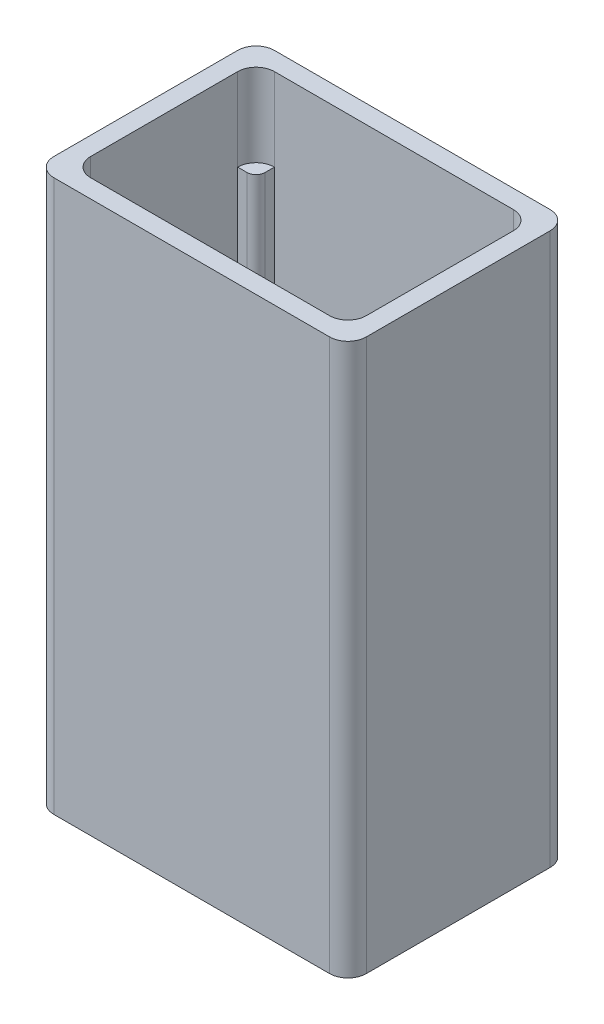
ISO-10303-21;
HEADER;
FILE_DESCRIPTION(('STEP AP214'),'2;1');
FILE_NAME('part.step','',(''),(''),'','','');
FILE_SCHEMA(('AUTOMOTIVE_DESIGN { 1 0 10303 214 1 1 1 1 }'));
ENDSEC;
DATA;
#1=APPLICATION_CONTEXT('core data for automotive mechanical design processes');
#2=APPLICATION_PROTOCOL_DEFINITION('international standard','automotive_design',2000,#1);
#3=PRODUCT_CONTEXT('',#1,'mechanical');
#4=PRODUCT('Part','Part','',(#3));
#5=PRODUCT_RELATED_PRODUCT_CATEGORY('part','',(#4));
#6=PRODUCT_DEFINITION_FORMATION('','',#4);
#7=PRODUCT_DEFINITION_CONTEXT('part definition',#1,'design');
#8=PRODUCT_DEFINITION('design','',#6,#7);
#9=PRODUCT_DEFINITION_SHAPE('','',#8);
#10=(LENGTH_UNIT() NAMED_UNIT(*) SI_UNIT(.MILLI.,.METRE.));
#11=(NAMED_UNIT(*) PLANE_ANGLE_UNIT() SI_UNIT($,.RADIAN.));
#12=(NAMED_UNIT(*) SI_UNIT($,.STERADIAN.) SOLID_ANGLE_UNIT());
#13=UNCERTAINTY_MEASURE_WITH_UNIT(LENGTH_MEASURE(1.E-05),#10,'distance_accuracy_value','');
#14=(GEOMETRIC_REPRESENTATION_CONTEXT(3) GLOBAL_UNCERTAINTY_ASSIGNED_CONTEXT((#13)) GLOBAL_UNIT_ASSIGNED_CONTEXT((#10,
#11,#12)) REPRESENTATION_CONTEXT('',''));
#15=CARTESIAN_POINT('',(0.,0.,0.));
#16=DIRECTION('',(0.,0.,1.));
#17=DIRECTION('',(1.,0.,0.));
#18=AXIS2_PLACEMENT_3D('',#15,#16,#17);
#19=CARTESIAN_POINT('',(15.,118.,8.));
#20=DIRECTION('',(-1.,0.,0.));
#21=DIRECTION('',(0.,0.,1.));
#22=AXIS2_PLACEMENT_3D('',#19,#20,#21);
#23=PLANE('',#22);
#24=DIRECTION('',(0.,0.,-1.));
#25=VECTOR('',#24,1.);
#26=CARTESIAN_POINT('',(15.,109.,-10.));
#27=LINE('',#26,#25);
#28=CARTESIAN_POINT('',(15.,109.,-6.93791118344072));
#29=VERTEX_POINT('',#28);
#30=CARTESIAN_POINT('',(15.,109.,-7.99999999999999));
#31=VERTEX_POINT('',#30);
#32=EDGE_CURVE('E223',#29,#31,#27,.T.);
#33=ORIENTED_EDGE('',*,*,#32,.F.);
#34=DIRECTION('',(0.,-1.,0.));
#35=VECTOR('',#34,1.);
#36=CARTESIAN_POINT('',(15.,109.,-6.93791118344072));
#37=LINE('',#36,#35);
#38=CARTESIAN_POINT('',(15.,58.,-6.93791118344072));
#39=VERTEX_POINT('',#38);
#40=EDGE_CURVE('E245',#29,#39,#37,.T.);
#41=ORIENTED_EDGE('',*,*,#40,.T.);
#42=DIRECTION('',(0.,0.,-1.));
#43=VECTOR('',#42,1.);
#44=CARTESIAN_POINT('',(15.,58.,8.));
#45=LINE('',#44,#43);
#46=CARTESIAN_POINT('',(15.,58.,8.));
#47=VERTEX_POINT('',#46);
#48=EDGE_CURVE('E269',#47,#39,#45,.T.);
#49=ORIENTED_EDGE('',*,*,#48,.F.);
#50=DIRECTION('',(0.,-1.,0.));
#51=VECTOR('',#50,1.);
#52=CARTESIAN_POINT('',(15.,118.,8.));
#53=LINE('',#52,#51);
#54=CARTESIAN_POINT('',(15.,118.,8.));
#55=VERTEX_POINT('',#54);
#56=EDGE_CURVE('E299',#55,#47,#53,.T.);
#57=ORIENTED_EDGE('',*,*,#56,.F.);
#58=DIRECTION('',(0.,0.,-1.));
#59=VECTOR('',#58,1.);
#60=CARTESIAN_POINT('',(15.,118.,8.));
#61=LINE('',#60,#59);
#62=CARTESIAN_POINT('',(15.,118.,-7.99999999999999));
#63=VERTEX_POINT('',#62);
#64=EDGE_CURVE('E250',#55,#63,#61,.T.);
#65=ORIENTED_EDGE('',*,*,#64,.T.);
#66=DIRECTION('',(0.,-1.,0.));
#67=VECTOR('',#66,1.);
#68=CARTESIAN_POINT('',(15.,118.,-7.99999999999999));
#69=LINE('',#68,#67);
#70=EDGE_CURVE('E296',#63,#31,#69,.T.);
#71=ORIENTED_EDGE('',*,*,#70,.T.);
#72=EDGE_LOOP('',(#33,#41,#49,#57,#65,#71));
#73=FACE_BOUND('',#72,.T.);
#74=ADVANCED_FACE('F33',(#73),#23,.T.);
#75=CARTESIAN_POINT('',(13.,118.,-8.00000000000001));
#76=DIRECTION('',(0.,-1.,0.));
#77=DIRECTION('',(0.,0.,-1.));
#78=AXIS2_PLACEMENT_3D('',#75,#76,#77);
#79=CYLINDRICAL_SURFACE('',#78,2.);
#80=DIRECTION('',(0.,-1.,0.));
#81=VECTOR('',#80,1.);
#82=CARTESIAN_POINT('',(13.,118.,-10.));
#83=LINE('',#82,#81);
#84=CARTESIAN_POINT('',(13.,118.,-10.));
#85=VERTEX_POINT('',#84);
#86=CARTESIAN_POINT('',(13.,109.,-10.));
#87=VERTEX_POINT('',#86);
#88=EDGE_CURVE('E293',#85,#87,#83,.T.);
#89=ORIENTED_EDGE('',*,*,#88,.T.);
#90=CARTESIAN_POINT('',(13.,109.,-8.00000000000001));
#91=DIRECTION('',(0.,-1.,0.));
#92=DIRECTION('',(0.,0.,-1.));
#93=AXIS2_PLACEMENT_3D('',#90,#91,#92);
#94=CIRCLE('',#93,2.);
#95=EDGE_CURVE('E41',#87,#31,#94,.T.);
#96=ORIENTED_EDGE('',*,*,#95,.T.);
#97=ORIENTED_EDGE('',*,*,#70,.F.);
#98=CARTESIAN_POINT('',(13.,118.,-8.00000000000001));
#99=DIRECTION('',(0.,1.,0.));
#100=DIRECTION('',(0.,0.,-1.));
#101=AXIS2_PLACEMENT_3D('',#98,#99,#100);
#102=CIRCLE('',#101,2.);
#103=EDGE_CURVE('E253',#63,#85,#102,.T.);
#104=ORIENTED_EDGE('',*,*,#103,.T.);
#105=EDGE_LOOP('',(#89,#96,#97,#104));
#106=FACE_BOUND('',#105,.T.);
#107=ADVANCED_FACE('F362',(#106),#79,.F.);
#108=CARTESIAN_POINT('',(15.,118.,10.));
#109=DIRECTION('',(0.,-1.,0.));
#110=DIRECTION('',(0.,0.,-1.));
#111=AXIS2_PLACEMENT_3D('',#108,#109,#110);
#112=PLANE('',#111);
#113=CARTESIAN_POINT('',(15.,118.,10.));
#114=DIRECTION('',(0.,1.,0.));
#115=DIRECTION('',(0.,0.,-1.));
#116=AXIS2_PLACEMENT_3D('',#113,#114,#115);
#117=CIRCLE('',#116,2.);
#118=CARTESIAN_POINT('',(15.,118.,12.));
#119=VERTEX_POINT('',#118);
#120=CARTESIAN_POINT('',(17.,118.,10.));
#121=VERTEX_POINT('',#120);
#122=EDGE_CURVE('E303',#119,#121,#117,.T.);
#123=ORIENTED_EDGE('',*,*,#122,.T.);
#124=DIRECTION('',(0.,0.,-1.));
#125=VECTOR('',#124,1.);
#126=CARTESIAN_POINT('',(17.,118.,10.));
#127=LINE('',#126,#125);
#128=CARTESIAN_POINT('',(17.,118.,-10.));
#129=VERTEX_POINT('',#128);
#130=EDGE_CURVE('E306',#121,#129,#127,.T.);
#131=ORIENTED_EDGE('',*,*,#130,.T.);
#132=CARTESIAN_POINT('',(15.,118.,-10.));
#133=DIRECTION('',(0.,1.,0.));
#134=DIRECTION('',(0.,0.,-1.));
#135=AXIS2_PLACEMENT_3D('',#132,#133,#134);
#136=CIRCLE('',#135,2.);
#137=CARTESIAN_POINT('',(15.,118.,-12.));
#138=VERTEX_POINT('',#137);
#139=EDGE_CURVE('E309',#129,#138,#136,.T.);
#140=ORIENTED_EDGE('',*,*,#139,.T.);
#141=DIRECTION('',(-1.,0.,0.));
#142=VECTOR('',#141,1.);
#143=CARTESIAN_POINT('',(-15.,118.,-12.));
#144=LINE('',#143,#142);
#145=CARTESIAN_POINT('',(-15.,118.,-12.));
#146=VERTEX_POINT('',#145);
#147=EDGE_CURVE('E311',#138,#146,#144,.T.);
#148=ORIENTED_EDGE('',*,*,#147,.T.);
#149=CARTESIAN_POINT('',(-15.,118.,-10.));
#150=DIRECTION('',(0.,1.,0.));
#151=DIRECTION('',(0.,0.,1.));
#152=AXIS2_PLACEMENT_3D('',#149,#150,#151);
#153=CIRCLE('',#152,2.);
#154=CARTESIAN_POINT('',(-17.,118.,-10.));
#155=VERTEX_POINT('',#154);
#156=EDGE_CURVE('E313',#146,#155,#153,.T.);
#157=ORIENTED_EDGE('',*,*,#156,.T.);
#158=DIRECTION('',(0.,0.,1.));
#159=VECTOR('',#158,1.);
#160=CARTESIAN_POINT('',(-17.,118.,10.));
#161=LINE('',#160,#159);
#162=CARTESIAN_POINT('',(-17.,118.,10.));
#163=VERTEX_POINT('',#162);
#164=EDGE_CURVE('E315',#155,#163,#161,.T.);
#165=ORIENTED_EDGE('',*,*,#164,.T.);
#166=CARTESIAN_POINT('',(-15.,118.,10.));
#167=DIRECTION('',(0.,1.,0.));
#168=DIRECTION('',(0.,0.,1.));
#169=AXIS2_PLACEMENT_3D('',#166,#167,#168);
#170=CIRCLE('',#169,2.);
#171=CARTESIAN_POINT('',(-15.,118.,12.));
#172=VERTEX_POINT('',#171);
#173=EDGE_CURVE('E317',#163,#172,#170,.T.);
#174=ORIENTED_EDGE('',*,*,#173,.T.);
#175=DIRECTION('',(1.,0.,0.));
#176=VECTOR('',#175,1.);
#177=CARTESIAN_POINT('',(-15.,118.,12.));
#178=LINE('',#177,#176);
#179=EDGE_CURVE('E319',#172,#119,#178,.T.);
#180=ORIENTED_EDGE('',*,*,#179,.T.);
#181=EDGE_LOOP('',(#123,#131,#140,#148,#157,#165,#174,#180));
#182=FACE_BOUND('',#181,.T.);
#183=CARTESIAN_POINT('',(13.,118.,8.));
#184=DIRECTION('',(0.,1.,0.));
#185=DIRECTION('',(0.,0.,-1.));
#186=AXIS2_PLACEMENT_3D('',#183,#184,#185);
#187=CIRCLE('',#186,2.);
#188=CARTESIAN_POINT('',(13.,118.,10.));
#189=VERTEX_POINT('',#188);
#190=EDGE_CURVE('E248',#189,#55,#187,.T.);
#191=ORIENTED_EDGE('',*,*,#190,.F.);
#192=DIRECTION('',(1.,0.,0.));
#193=VECTOR('',#192,1.);
#194=CARTESIAN_POINT('',(-13.,118.,10.));
#195=LINE('',#194,#193);
#196=CARTESIAN_POINT('',(-13.,118.,10.));
#197=VERTEX_POINT('',#196);
#198=EDGE_CURVE('E264',#197,#189,#195,.T.);
#199=ORIENTED_EDGE('',*,*,#198,.F.);
#200=CARTESIAN_POINT('',(-13.,118.,8.));
#201=DIRECTION('',(0.,1.,0.));
#202=DIRECTION('',(0.,0.,1.));
#203=AXIS2_PLACEMENT_3D('',#200,#201,#202);
#204=CIRCLE('',#203,2.);
#205=CARTESIAN_POINT('',(-15.,118.,8.));
#206=VERTEX_POINT('',#205);
#207=EDGE_CURVE('E261',#206,#197,#204,.T.);
#208=ORIENTED_EDGE('',*,*,#207,.F.);
#209=DIRECTION('',(0.,0.,1.));
#210=VECTOR('',#209,1.);
#211=CARTESIAN_POINT('',(-15.,118.,8.));
#212=LINE('',#211,#210);
#213=CARTESIAN_POINT('',(-15.,118.,-7.99999999999999));
#214=VERTEX_POINT('',#213);
#215=EDGE_CURVE('E259',#214,#206,#212,.T.);
#216=ORIENTED_EDGE('',*,*,#215,.F.);
#217=CARTESIAN_POINT('',(-13.,118.,-8.));
#218=DIRECTION('',(0.,1.,0.));
#219=DIRECTION('',(0.,0.,1.));
#220=AXIS2_PLACEMENT_3D('',#217,#218,#219);
#221=CIRCLE('',#220,2.);
#222=CARTESIAN_POINT('',(-13.,118.,-10.));
#223=VERTEX_POINT('',#222);
#224=EDGE_CURVE('E257',#223,#214,#221,.T.);
#225=ORIENTED_EDGE('',*,*,#224,.F.);
#226=DIRECTION('',(-1.,0.,0.));
#227=VECTOR('',#226,1.);
#228=CARTESIAN_POINT('',(-13.,118.,-10.));
#229=LINE('',#228,#227);
#230=EDGE_CURVE('E255',#85,#223,#229,.T.);
#231=ORIENTED_EDGE('',*,*,#230,.F.);
#232=ORIENTED_EDGE('',*,*,#103,.F.);
#233=ORIENTED_EDGE('',*,*,#64,.F.);
#234=EDGE_LOOP('',(#191,#199,#208,#216,#225,#231,#232,#233));
#235=FACE_BOUND('',#234,.T.);
#236=ADVANCED_FACE('F392',(#182,#235),#112,.F.);
#237=CARTESIAN_POINT('',(15.,58.,10.));
#238=DIRECTION('',(0.,-1.,0.));
#239=DIRECTION('',(0.,0.,-1.));
#240=AXIS2_PLACEMENT_3D('',#237,#238,#239);
#241=PLANE('',#240);
#242=DIRECTION('',(-1.,0.,0.));
#243=VECTOR('',#242,1.);
#244=CARTESIAN_POINT('',(-13.,58.,-10.));
#245=LINE('',#244,#243);
#246=CARTESIAN_POINT('',(13.,58.,-10.));
#247=VERTEX_POINT('',#246);
#248=CARTESIAN_POINT('',(-13.,58.,-10.));
#249=VERTEX_POINT('',#248);
#250=EDGE_CURVE('E272',#247,#249,#245,.T.);
#251=ORIENTED_EDGE('',*,*,#250,.T.);
#252=DIRECTION('',(0.,0.,-1.));
#253=VECTOR('',#252,1.);
#254=CARTESIAN_POINT('',(-13.,58.,-8.99999999999999));
#255=LINE('',#254,#253);
#256=CARTESIAN_POINT('',(-13.,58.,-8.99999999999999));
#257=VERTEX_POINT('',#256);
#258=EDGE_CURVE('E210',#257,#249,#255,.T.);
#259=ORIENTED_EDGE('',*,*,#258,.F.);
#260=CARTESIAN_POINT('',(-14.,58.,-8.99999999999999));
#261=DIRECTION('',(0.,1.,0.));
#262=DIRECTION('',(0.,0.,1.));
#263=AXIS2_PLACEMENT_3D('',#260,#261,#262);
#264=CIRCLE('',#263,1.);
#265=CARTESIAN_POINT('',(-14.,58.,-7.99999999999999));
#266=VERTEX_POINT('',#265);
#267=EDGE_CURVE('E214',#266,#257,#264,.T.);
#268=ORIENTED_EDGE('',*,*,#267,.F.);
#269=DIRECTION('',(1.,0.,0.));
#270=VECTOR('',#269,1.);
#271=CARTESIAN_POINT('',(-15.,58.,-7.99999999999999));
#272=LINE('',#271,#270);
#273=CARTESIAN_POINT('',(-15.,58.,-7.99999999999999));
#274=VERTEX_POINT('',#273);
#275=EDGE_CURVE('E198',#274,#266,#272,.T.);
#276=ORIENTED_EDGE('',*,*,#275,.F.);
#277=DIRECTION('',(0.,0.,1.));
#278=VECTOR('',#277,1.);
#279=CARTESIAN_POINT('',(-15.,58.,8.));
#280=LINE('',#279,#278);
#281=CARTESIAN_POINT('',(-15.,58.,8.));
#282=VERTEX_POINT('',#281);
#283=EDGE_CURVE('E275',#274,#282,#280,.T.);
#284=ORIENTED_EDGE('',*,*,#283,.T.);
#285=CARTESIAN_POINT('',(-13.,58.,8.));
#286=DIRECTION('',(0.,1.,0.));
#287=DIRECTION('',(0.,0.,1.));
#288=AXIS2_PLACEMENT_3D('',#285,#286,#287);
#289=CIRCLE('',#288,2.);
#290=CARTESIAN_POINT('',(-13.,58.,10.));
#291=VERTEX_POINT('',#290);
#292=EDGE_CURVE('E278',#282,#291,#289,.T.);
#293=ORIENTED_EDGE('',*,*,#292,.T.);
#294=DIRECTION('',(1.,0.,0.));
#295=VECTOR('',#294,1.);
#296=CARTESIAN_POINT('',(-13.,58.,10.));
#297=LINE('',#296,#295);
#298=CARTESIAN_POINT('',(13.,58.,10.));
#299=VERTEX_POINT('',#298);
#300=EDGE_CURVE('E251',#291,#299,#297,.T.);
#301=ORIENTED_EDGE('',*,*,#300,.T.);
#302=CARTESIAN_POINT('',(13.,58.,8.));
#303=DIRECTION('',(0.,1.,0.));
#304=DIRECTION('',(0.,0.,-1.));
#305=AXIS2_PLACEMENT_3D('',#302,#303,#304);
#306=CIRCLE('',#305,2.);
#307=EDGE_CURVE('E247',#299,#47,#306,.T.);
#308=ORIENTED_EDGE('',*,*,#307,.T.);
#309=ORIENTED_EDGE('',*,*,#48,.T.);
#310=DIRECTION('',(1.,0.,0.));
#311=VECTOR('',#310,1.);
#312=CARTESIAN_POINT('',(15.,58.,-6.93791118344072));
#313=LINE('',#312,#311);
#314=CARTESIAN_POINT('',(13.5,58.,-6.93791118344072));
#315=VERTEX_POINT('',#314);
#316=EDGE_CURVE('E219',#315,#39,#313,.T.);
#317=ORIENTED_EDGE('',*,*,#316,.F.);
#318=CARTESIAN_POINT('',(13.5,58.,-7.43791118344072));
#319=DIRECTION('',(0.,1.,0.));
#320=DIRECTION('',(0.,0.,-1.));
#321=AXIS2_PLACEMENT_3D('',#318,#319,#320);
#322=CIRCLE('',#321,0.5);
#323=CARTESIAN_POINT('',(13.,58.,-7.43791118344072));
#324=VERTEX_POINT('',#323);
#325=EDGE_CURVE('E224',#324,#315,#322,.T.);
#326=ORIENTED_EDGE('',*,*,#325,.F.);
#327=DIRECTION('',(0.,0.,1.));
#328=VECTOR('',#327,1.);
#329=CARTESIAN_POINT('',(13.,58.,-7.43791118344072));
#330=LINE('',#329,#328);
#331=EDGE_CURVE('E234',#247,#324,#330,.T.);
#332=ORIENTED_EDGE('',*,*,#331,.F.);
#333=EDGE_LOOP('',(#251,#259,#268,#276,#284,#293,#301,#308,#309,#317,#326,#332));
#334=FACE_BOUND('',#333,.T.);
#335=CARTESIAN_POINT('',(15.,58.,10.));
#336=DIRECTION('',(0.,1.,0.));
#337=DIRECTION('',(0.,0.,-1.));
#338=AXIS2_PLACEMENT_3D('',#335,#336,#337);
#339=CIRCLE('',#338,2.);
#340=CARTESIAN_POINT('',(15.,58.,12.));
#341=VERTEX_POINT('',#340);
#342=CARTESIAN_POINT('',(17.,58.,10.));
#343=VERTEX_POINT('',#342);
#344=EDGE_CURVE('E302',#341,#343,#339,.T.);
#345=ORIENTED_EDGE('',*,*,#344,.F.);
#346=DIRECTION('',(1.,0.,0.));
#347=VECTOR('',#346,1.);
#348=CARTESIAN_POINT('',(-15.,58.,12.));
#349=LINE('',#348,#347);
#350=CARTESIAN_POINT('',(-15.,58.,12.));
#351=VERTEX_POINT('',#350);
#352=EDGE_CURVE('E307',#351,#341,#349,.T.);
#353=ORIENTED_EDGE('',*,*,#352,.F.);
#354=CARTESIAN_POINT('',(-15.,58.,10.));
#355=DIRECTION('',(0.,1.,0.));
#356=DIRECTION('',(0.,0.,1.));
#357=AXIS2_PLACEMENT_3D('',#354,#355,#356);
#358=CIRCLE('',#357,2.);
#359=CARTESIAN_POINT('',(-17.,58.,10.));
#360=VERTEX_POINT('',#359);
#361=EDGE_CURVE('E334',#360,#351,#358,.T.);
#362=ORIENTED_EDGE('',*,*,#361,.F.);
#363=DIRECTION('',(0.,0.,1.));
#364=VECTOR('',#363,1.);
#365=CARTESIAN_POINT('',(-17.,58.,10.));
#366=LINE('',#365,#364);
#367=CARTESIAN_POINT('',(-17.,58.,-10.));
#368=VERTEX_POINT('',#367);
#369=EDGE_CURVE('E332',#368,#360,#366,.T.);
#370=ORIENTED_EDGE('',*,*,#369,.F.);
#371=CARTESIAN_POINT('',(-15.,58.,-10.));
#372=DIRECTION('',(0.,1.,0.));
#373=DIRECTION('',(0.,0.,1.));
#374=AXIS2_PLACEMENT_3D('',#371,#372,#373);
#375=CIRCLE('',#374,2.);
#376=CARTESIAN_POINT('',(-15.,58.,-12.));
#377=VERTEX_POINT('',#376);
#378=EDGE_CURVE('E330',#377,#368,#375,.T.);
#379=ORIENTED_EDGE('',*,*,#378,.F.);
#380=DIRECTION('',(-1.,0.,0.));
#381=VECTOR('',#380,1.);
#382=CARTESIAN_POINT('',(-15.,58.,-12.));
#383=LINE('',#382,#381);
#384=CARTESIAN_POINT('',(15.,58.,-12.));
#385=VERTEX_POINT('',#384);
#386=EDGE_CURVE('E328',#385,#377,#383,.T.);
#387=ORIENTED_EDGE('',*,*,#386,.F.);
#388=CARTESIAN_POINT('',(15.,58.,-10.));
#389=DIRECTION('',(0.,1.,0.));
#390=DIRECTION('',(0.,0.,-1.));
#391=AXIS2_PLACEMENT_3D('',#388,#389,#390);
#392=CIRCLE('',#391,2.);
#393=CARTESIAN_POINT('',(17.,58.,-10.));
#394=VERTEX_POINT('',#393);
#395=EDGE_CURVE('E326',#394,#385,#392,.T.);
#396=ORIENTED_EDGE('',*,*,#395,.F.);
#397=DIRECTION('',(0.,0.,-1.));
#398=VECTOR('',#397,1.);
#399=CARTESIAN_POINT('',(17.,58.,10.));
#400=LINE('',#399,#398);
#401=EDGE_CURVE('E324',#343,#394,#400,.T.);
#402=ORIENTED_EDGE('',*,*,#401,.F.);
#403=EDGE_LOOP('',(#345,#353,#362,#370,#379,#387,#396,#402));
#404=FACE_BOUND('',#403,.T.);
#405=ADVANCED_FACE('F379',(#334,#404),#241,.T.);
#406=CARTESIAN_POINT('',(15.,118.,10.));
#407=DIRECTION('',(0.,-1.,0.));
#408=DIRECTION('',(0.,0.,-1.));
#409=AXIS2_PLACEMENT_3D('',#406,#407,#408);
#410=CYLINDRICAL_SURFACE('',#409,2.);
#411=ORIENTED_EDGE('',*,*,#344,.T.);
#412=DIRECTION('',(0.,-1.,0.));
#413=VECTOR('',#412,1.);
#414=CARTESIAN_POINT('',(17.,118.,10.));
#415=LINE('',#414,#413);
#416=EDGE_CURVE('E357',#121,#343,#415,.T.);
#417=ORIENTED_EDGE('',*,*,#416,.F.);
#418=ORIENTED_EDGE('',*,*,#122,.F.);
#419=DIRECTION('',(0.,-1.,0.));
#420=VECTOR('',#419,1.);
#421=CARTESIAN_POINT('',(15.,118.,12.));
#422=LINE('',#421,#420);
#423=EDGE_CURVE('E321',#119,#341,#422,.T.);
#424=ORIENTED_EDGE('',*,*,#423,.T.);
#425=EDGE_LOOP('',(#411,#417,#418,#424));
#426=FACE_BOUND('',#425,.T.);
#427=ADVANCED_FACE('F35',(#426),#410,.T.);
#428=CARTESIAN_POINT('',(17.,118.,10.));
#429=DIRECTION('',(-1.,0.,0.));
#430=DIRECTION('',(0.,0.,1.));
#431=AXIS2_PLACEMENT_3D('',#428,#429,#430);
#432=PLANE('',#431);
#433=ORIENTED_EDGE('',*,*,#401,.T.);
#434=DIRECTION('',(0.,-1.,0.));
#435=VECTOR('',#434,1.);
#436=CARTESIAN_POINT('',(17.,118.,-10.));
#437=LINE('',#436,#435);
#438=EDGE_CURVE('E354',#129,#394,#437,.T.);
#439=ORIENTED_EDGE('',*,*,#438,.F.);
#440=ORIENTED_EDGE('',*,*,#130,.F.);
#441=ORIENTED_EDGE('',*,*,#416,.T.);
#442=EDGE_LOOP('',(#433,#439,#440,#441));
#443=FACE_BOUND('',#442,.T.);
#444=ADVANCED_FACE('F452',(#443),#432,.F.);
#445=CARTESIAN_POINT('',(15.,118.,-10.));
#446=DIRECTION('',(0.,-1.,0.));
#447=DIRECTION('',(0.,0.,-1.));
#448=AXIS2_PLACEMENT_3D('',#445,#446,#447);
#449=CYLINDRICAL_SURFACE('',#448,2.);
#450=ORIENTED_EDGE('',*,*,#395,.T.);
#451=DIRECTION('',(0.,-1.,0.));
#452=VECTOR('',#451,1.);
#453=CARTESIAN_POINT('',(15.,118.,-12.));
#454=LINE('',#453,#452);
#455=EDGE_CURVE('E351',#138,#385,#454,.T.);
#456=ORIENTED_EDGE('',*,*,#455,.F.);
#457=ORIENTED_EDGE('',*,*,#139,.F.);
#458=ORIENTED_EDGE('',*,*,#438,.T.);
#459=EDGE_LOOP('',(#450,#456,#457,#458));
#460=FACE_BOUND('',#459,.T.);
#461=ADVANCED_FACE('F449',(#460),#449,.T.);
#462=CARTESIAN_POINT('',(-15.,118.,-12.));
#463=DIRECTION('',(0.,0.,1.));
#464=DIRECTION('',(1.,0.,0.));
#465=AXIS2_PLACEMENT_3D('',#462,#463,#464);
#466=PLANE('',#465);
#467=ORIENTED_EDGE('',*,*,#386,.T.);
#468=DIRECTION('',(0.,-1.,0.));
#469=VECTOR('',#468,1.);
#470=CARTESIAN_POINT('',(-15.,118.,-12.));
#471=LINE('',#470,#469);
#472=EDGE_CURVE('E348',#146,#377,#471,.T.);
#473=ORIENTED_EDGE('',*,*,#472,.F.);
#474=ORIENTED_EDGE('',*,*,#147,.F.);
#475=ORIENTED_EDGE('',*,*,#455,.T.);
#476=EDGE_LOOP('',(#467,#473,#474,#475));
#477=FACE_BOUND('',#476,.T.);
#478=ADVANCED_FACE('F445',(#477),#466,.F.);
#479=CARTESIAN_POINT('',(-15.,118.,-10.));
#480=DIRECTION('',(0.,-1.,0.));
#481=DIRECTION('',(0.,0.,-1.));
#482=AXIS2_PLACEMENT_3D('',#479,#480,#481);
#483=CYLINDRICAL_SURFACE('',#482,2.);
#484=ORIENTED_EDGE('',*,*,#378,.T.);
#485=DIRECTION('',(0.,-1.,0.));
#486=VECTOR('',#485,1.);
#487=CARTESIAN_POINT('',(-17.,118.,-10.));
#488=LINE('',#487,#486);
#489=EDGE_CURVE('E345',#155,#368,#488,.T.);
#490=ORIENTED_EDGE('',*,*,#489,.F.);
#491=ORIENTED_EDGE('',*,*,#156,.F.);
#492=ORIENTED_EDGE('',*,*,#472,.T.);
#493=EDGE_LOOP('',(#484,#490,#491,#492));
#494=FACE_BOUND('',#493,.T.);
#495=ADVANCED_FACE('F441',(#494),#483,.T.);
#496=CARTESIAN_POINT('',(-17.,118.,10.));
#497=DIRECTION('',(1.,0.,0.));
#498=DIRECTION('',(0.,0.,-1.));
#499=AXIS2_PLACEMENT_3D('',#496,#497,#498);
#500=PLANE('',#499);
#501=ORIENTED_EDGE('',*,*,#369,.T.);
#502=DIRECTION('',(0.,-1.,0.));
#503=VECTOR('',#502,1.);
#504=CARTESIAN_POINT('',(-17.,118.,10.));
#505=LINE('',#504,#503);
#506=EDGE_CURVE('E342',#163,#360,#505,.T.);
#507=ORIENTED_EDGE('',*,*,#506,.F.);
#508=ORIENTED_EDGE('',*,*,#164,.F.);
#509=ORIENTED_EDGE('',*,*,#489,.T.);
#510=EDGE_LOOP('',(#501,#507,#508,#509));
#511=FACE_BOUND('',#510,.T.);
#512=ADVANCED_FACE('F437',(#511),#500,.F.);
#513=CARTESIAN_POINT('',(-15.,118.,10.));
#514=DIRECTION('',(0.,-1.,0.));
#515=DIRECTION('',(0.,0.,-1.));
#516=AXIS2_PLACEMENT_3D('',#513,#514,#515);
#517=CYLINDRICAL_SURFACE('',#516,2.);
#518=ORIENTED_EDGE('',*,*,#361,.T.);
#519=DIRECTION('',(0.,-1.,0.));
#520=VECTOR('',#519,1.);
#521=CARTESIAN_POINT('',(-15.,118.,12.));
#522=LINE('',#521,#520);
#523=EDGE_CURVE('E339',#172,#351,#522,.T.);
#524=ORIENTED_EDGE('',*,*,#523,.F.);
#525=ORIENTED_EDGE('',*,*,#173,.F.);
#526=ORIENTED_EDGE('',*,*,#506,.T.);
#527=EDGE_LOOP('',(#518,#524,#525,#526));
#528=FACE_BOUND('',#527,.T.);
#529=ADVANCED_FACE('F433',(#528),#517,.T.);
#530=CARTESIAN_POINT('',(-15.,118.,12.));
#531=DIRECTION('',(0.,0.,-1.));
#532=DIRECTION('',(-1.,0.,0.));
#533=AXIS2_PLACEMENT_3D('',#530,#531,#532);
#534=PLANE('',#533);
#535=ORIENTED_EDGE('',*,*,#352,.T.);
#536=ORIENTED_EDGE('',*,*,#423,.F.);
#537=ORIENTED_EDGE('',*,*,#179,.F.);
#538=ORIENTED_EDGE('',*,*,#523,.T.);
#539=EDGE_LOOP('',(#535,#536,#537,#538));
#540=FACE_BOUND('',#539,.T.);
#541=ADVANCED_FACE('F425',(#540),#534,.F.);
#542=CARTESIAN_POINT('',(13.,118.,8.));
#543=DIRECTION('',(0.,-1.,0.));
#544=DIRECTION('',(0.,0.,-1.));
#545=AXIS2_PLACEMENT_3D('',#542,#543,#544);
#546=CYLINDRICAL_SURFACE('',#545,2.);
#547=ORIENTED_EDGE('',*,*,#307,.F.);
#548=DIRECTION('',(0.,-1.,0.));
#549=VECTOR('',#548,1.);
#550=CARTESIAN_POINT('',(13.,118.,10.));
#551=LINE('',#550,#549);
#552=EDGE_CURVE('E266',#189,#299,#551,.T.);
#553=ORIENTED_EDGE('',*,*,#552,.F.);
#554=ORIENTED_EDGE('',*,*,#190,.T.);
#555=ORIENTED_EDGE('',*,*,#56,.T.);
#556=EDGE_LOOP('',(#547,#553,#554,#555));
#557=FACE_BOUND('',#556,.T.);
#558=ADVANCED_FACE('F385',(#557),#546,.F.);
#559=CARTESIAN_POINT('',(-13.,118.,-10.));
#560=DIRECTION('',(0.,0.,1.));
#561=DIRECTION('',(1.,0.,0.));
#562=AXIS2_PLACEMENT_3D('',#559,#560,#561);
#563=PLANE('',#562);
#564=ORIENTED_EDGE('',*,*,#250,.F.);
#565=DIRECTION('',(0.,-1.,0.));
#566=VECTOR('',#565,1.);
#567=CARTESIAN_POINT('',(13.,109.,-10.));
#568=LINE('',#567,#566);
#569=EDGE_CURVE('E242',#87,#247,#568,.T.);
#570=ORIENTED_EDGE('',*,*,#569,.F.);
#571=ORIENTED_EDGE('',*,*,#88,.F.);
#572=ORIENTED_EDGE('',*,*,#230,.T.);
#573=DIRECTION('',(0.,-1.,0.));
#574=VECTOR('',#573,1.);
#575=CARTESIAN_POINT('',(-13.,118.,-10.));
#576=LINE('',#575,#574);
#577=CARTESIAN_POINT('',(-13.,109.,-10.));
#578=VERTEX_POINT('',#577);
#579=EDGE_CURVE('E291',#223,#578,#576,.T.);
#580=ORIENTED_EDGE('',*,*,#579,.T.);
#581=DIRECTION('',(0.,-1.,0.));
#582=VECTOR('',#581,1.);
#583=CARTESIAN_POINT('',(-13.,109.,-10.));
#584=LINE('',#583,#582);
#585=EDGE_CURVE('E217',#578,#249,#584,.T.);
#586=ORIENTED_EDGE('',*,*,#585,.T.);
#587=EDGE_LOOP('',(#564,#570,#571,#572,#580,#586));
#588=FACE_BOUND('',#587,.T.);
#589=ADVANCED_FACE('F397',(#588),#563,.T.);
#590=CARTESIAN_POINT('',(-13.,118.,-8.));
#591=DIRECTION('',(0.,-1.,0.));
#592=DIRECTION('',(0.,0.,-1.));
#593=AXIS2_PLACEMENT_3D('',#590,#591,#592);
#594=CYLINDRICAL_SURFACE('',#593,2.);
#595=CARTESIAN_POINT('',(-13.,109.,-8.));
#596=DIRECTION('',(0.,1.,0.));
#597=DIRECTION('',(0.,0.,1.));
#598=AXIS2_PLACEMENT_3D('',#595,#596,#597);
#599=CIRCLE('',#598,2.);
#600=CARTESIAN_POINT('',(-15.,109.,-7.99999999999999));
#601=VERTEX_POINT('',#600);
#602=EDGE_CURVE('E11',#578,#601,#599,.T.);
#603=ORIENTED_EDGE('',*,*,#602,.F.);
#604=ORIENTED_EDGE('',*,*,#579,.F.);
#605=ORIENTED_EDGE('',*,*,#224,.T.);
#606=DIRECTION('',(0.,-1.,0.));
#607=VECTOR('',#606,1.);
#608=CARTESIAN_POINT('',(-15.,118.,-7.99999999999999));
#609=LINE('',#608,#607);
#610=EDGE_CURVE('E289',#214,#601,#609,.T.);
#611=ORIENTED_EDGE('',*,*,#610,.T.);
#612=EDGE_LOOP('',(#603,#604,#605,#611));
#613=FACE_BOUND('',#612,.T.);
#614=ADVANCED_FACE('F643',(#613),#594,.F.);
#615=CARTESIAN_POINT('',(-15.,118.,8.));
#616=DIRECTION('',(1.,0.,0.));
#617=DIRECTION('',(0.,0.,-1.));
#618=AXIS2_PLACEMENT_3D('',#615,#616,#617);
#619=PLANE('',#618);
#620=ORIENTED_EDGE('',*,*,#283,.F.);
#621=DIRECTION('',(0.,-1.,0.));
#622=VECTOR('',#621,1.);
#623=CARTESIAN_POINT('',(-15.,109.,-7.99999999999999));
#624=LINE('',#623,#622);
#625=EDGE_CURVE('E54',#601,#274,#624,.T.);
#626=ORIENTED_EDGE('',*,*,#625,.F.);
#627=ORIENTED_EDGE('',*,*,#610,.F.);
#628=ORIENTED_EDGE('',*,*,#215,.T.);
#629=DIRECTION('',(0.,-1.,0.));
#630=VECTOR('',#629,1.);
#631=CARTESIAN_POINT('',(-15.,118.,8.));
#632=LINE('',#631,#630);
#633=EDGE_CURVE('E287',#206,#282,#632,.T.);
#634=ORIENTED_EDGE('',*,*,#633,.T.);
#635=EDGE_LOOP('',(#620,#626,#627,#628,#634));
#636=FACE_BOUND('',#635,.T.);
#637=ADVANCED_FACE('F521',(#636),#619,.T.);
#638=CARTESIAN_POINT('',(-13.,118.,8.));
#639=DIRECTION('',(0.,-1.,0.));
#640=DIRECTION('',(0.,0.,-1.));
#641=AXIS2_PLACEMENT_3D('',#638,#639,#640);
#642=CYLINDRICAL_SURFACE('',#641,2.);
#643=ORIENTED_EDGE('',*,*,#292,.F.);
#644=ORIENTED_EDGE('',*,*,#633,.F.);
#645=ORIENTED_EDGE('',*,*,#207,.T.);
#646=DIRECTION('',(0.,-1.,0.));
#647=VECTOR('',#646,1.);
#648=CARTESIAN_POINT('',(-13.,118.,10.));
#649=LINE('',#648,#647);
#650=EDGE_CURVE('E285',#197,#291,#649,.T.);
#651=ORIENTED_EDGE('',*,*,#650,.T.);
#652=EDGE_LOOP('',(#643,#644,#645,#651));
#653=FACE_BOUND('',#652,.T.);
#654=ADVANCED_FACE('F511',(#653),#642,.F.);
#655=CARTESIAN_POINT('',(-13.,118.,10.));
#656=DIRECTION('',(0.,0.,-1.));
#657=DIRECTION('',(-1.,0.,0.));
#658=AXIS2_PLACEMENT_3D('',#655,#656,#657);
#659=PLANE('',#658);
#660=ORIENTED_EDGE('',*,*,#300,.F.);
#661=ORIENTED_EDGE('',*,*,#650,.F.);
#662=ORIENTED_EDGE('',*,*,#198,.T.);
#663=ORIENTED_EDGE('',*,*,#552,.T.);
#664=EDGE_LOOP('',(#660,#661,#662,#663));
#665=FACE_BOUND('',#664,.T.);
#666=ADVANCED_FACE('F388',(#665),#659,.T.);
#667=CARTESIAN_POINT('',(13.5,109.,-7.43791118344072));
#668=DIRECTION('',(0.,-1.,0.));
#669=DIRECTION('',(0.,0.,-1.));
#670=AXIS2_PLACEMENT_3D('',#667,#668,#669);
#671=PLANE('',#670);
#672=ORIENTED_EDGE('',*,*,#95,.F.);
#673=DIRECTION('',(0.,0.,1.));
#674=VECTOR('',#673,1.);
#675=CARTESIAN_POINT('',(13.,109.,-7.43791118344072));
#676=LINE('',#675,#674);
#677=CARTESIAN_POINT('',(13.,109.,-7.43791118344072));
#678=VERTEX_POINT('',#677);
#679=EDGE_CURVE('E227',#87,#678,#676,.T.);
#680=ORIENTED_EDGE('',*,*,#679,.T.);
#681=CARTESIAN_POINT('',(13.5,109.,-7.43791118344072));
#682=DIRECTION('',(0.,1.,0.));
#683=DIRECTION('',(0.,0.,-1.));
#684=AXIS2_PLACEMENT_3D('',#681,#682,#683);
#685=CIRCLE('',#684,0.5);
#686=CARTESIAN_POINT('',(13.5,109.,-6.93791118344072));
#687=VERTEX_POINT('',#686);
#688=EDGE_CURVE('E229',#678,#687,#685,.T.);
#689=ORIENTED_EDGE('',*,*,#688,.T.);
#690=DIRECTION('',(1.,0.,0.));
#691=VECTOR('',#690,1.);
#692=CARTESIAN_POINT('',(15.,109.,-6.93791118344072));
#693=LINE('',#692,#691);
#694=EDGE_CURVE('E220',#687,#29,#693,.T.);
#695=ORIENTED_EDGE('',*,*,#694,.T.);
#696=ORIENTED_EDGE('',*,*,#32,.T.);
#697=EDGE_LOOP('',(#672,#680,#689,#695,#696));
#698=FACE_BOUND('',#697,.T.);
#699=ADVANCED_FACE('F370',(#698),#671,.F.);
#700=CARTESIAN_POINT('',(15.,109.,-6.93791118344072));
#701=DIRECTION('',(0.,0.,-1.));
#702=DIRECTION('',(-1.,0.,0.));
#703=AXIS2_PLACEMENT_3D('',#700,#701,#702);
#704=PLANE('',#703);
#705=ORIENTED_EDGE('',*,*,#316,.T.);
#706=ORIENTED_EDGE('',*,*,#40,.F.);
#707=ORIENTED_EDGE('',*,*,#694,.F.);
#708=DIRECTION('',(0.,-1.,0.));
#709=VECTOR('',#708,1.);
#710=CARTESIAN_POINT('',(13.5,109.,-6.93791118344072));
#711=LINE('',#710,#709);
#712=EDGE_CURVE('E231',#687,#315,#711,.T.);
#713=ORIENTED_EDGE('',*,*,#712,.T.);
#714=EDGE_LOOP('',(#705,#706,#707,#713));
#715=FACE_BOUND('',#714,.T.);
#716=ADVANCED_FACE('F376',(#715),#704,.F.);
#717=CARTESIAN_POINT('',(13.,109.,-7.43791118344072));
#718=DIRECTION('',(1.,0.,0.));
#719=DIRECTION('',(0.,0.,-1.));
#720=AXIS2_PLACEMENT_3D('',#717,#718,#719);
#721=PLANE('',#720);
#722=ORIENTED_EDGE('',*,*,#331,.T.);
#723=DIRECTION('',(0.,-1.,0.));
#724=VECTOR('',#723,1.);
#725=CARTESIAN_POINT('',(13.,109.,-7.43791118344072));
#726=LINE('',#725,#724);
#727=EDGE_CURVE('E239',#678,#324,#726,.T.);
#728=ORIENTED_EDGE('',*,*,#727,.F.);
#729=ORIENTED_EDGE('',*,*,#679,.F.);
#730=ORIENTED_EDGE('',*,*,#569,.T.);
#731=EDGE_LOOP('',(#722,#728,#729,#730));
#732=FACE_BOUND('',#731,.T.);
#733=ADVANCED_FACE('F400',(#732),#721,.F.);
#734=CARTESIAN_POINT('',(13.5,109.,-7.43791118344072));
#735=DIRECTION('',(0.,-1.,0.));
#736=DIRECTION('',(0.,0.,-1.));
#737=AXIS2_PLACEMENT_3D('',#734,#735,#736);
#738=CYLINDRICAL_SURFACE('',#737,0.5);
#739=ORIENTED_EDGE('',*,*,#325,.T.);
#740=ORIENTED_EDGE('',*,*,#712,.F.);
#741=ORIENTED_EDGE('',*,*,#688,.F.);
#742=ORIENTED_EDGE('',*,*,#727,.T.);
#743=EDGE_LOOP('',(#739,#740,#741,#742));
#744=FACE_BOUND('',#743,.T.);
#745=ADVANCED_FACE('F404',(#744),#738,.T.);
#746=CARTESIAN_POINT('',(-14.,109.,-8.99999999999999));
#747=DIRECTION('',(0.,1.,0.));
#748=DIRECTION('',(0.,0.,1.));
#749=AXIS2_PLACEMENT_3D('',#746,#747,#748);
#750=PLANE('',#749);
#751=DIRECTION('',(0.,0.,-1.));
#752=VECTOR('',#751,1.);
#753=CARTESIAN_POINT('',(-13.,109.,-8.99999999999999));
#754=LINE('',#753,#752);
#755=CARTESIAN_POINT('',(-13.,109.,-8.99999999999999));
#756=VERTEX_POINT('',#755);
#757=EDGE_CURVE('E192',#756,#578,#754,.T.);
#758=ORIENTED_EDGE('',*,*,#757,.T.);
#759=ORIENTED_EDGE('',*,*,#602,.T.);
#760=DIRECTION('',(1.,0.,0.));
#761=VECTOR('',#760,1.);
#762=CARTESIAN_POINT('',(-15.,109.,-7.99999999999999));
#763=LINE('',#762,#761);
#764=CARTESIAN_POINT('',(-14.,109.,-7.99999999999999));
#765=VERTEX_POINT('',#764);
#766=EDGE_CURVE('E184',#601,#765,#763,.T.);
#767=ORIENTED_EDGE('',*,*,#766,.T.);
#768=CARTESIAN_POINT('',(-14.,109.,-8.99999999999999));
#769=DIRECTION('',(0.,1.,0.));
#770=DIRECTION('',(0.,0.,1.));
#771=AXIS2_PLACEMENT_3D('',#768,#769,#770);
#772=CIRCLE('',#771,1.);
#773=EDGE_CURVE('E189',#765,#756,#772,.T.);
#774=ORIENTED_EDGE('',*,*,#773,.T.);
#775=EDGE_LOOP('',(#758,#759,#767,#774));
#776=FACE_BOUND('',#775,.T.);
#777=ADVANCED_FACE('F187',(#776),#750,.T.);
#778=CARTESIAN_POINT('',(-13.,109.,-8.99999999999999));
#779=DIRECTION('',(-1.,0.,0.));
#780=DIRECTION('',(0.,0.,1.));
#781=AXIS2_PLACEMENT_3D('',#778,#779,#780);
#782=PLANE('',#781);
#783=ORIENTED_EDGE('',*,*,#258,.T.);
#784=ORIENTED_EDGE('',*,*,#585,.F.);
#785=ORIENTED_EDGE('',*,*,#757,.F.);
#786=DIRECTION('',(0.,-1.,0.));
#787=VECTOR('',#786,1.);
#788=CARTESIAN_POINT('',(-13.,109.,-8.99999999999999));
#789=LINE('',#788,#787);
#790=EDGE_CURVE('E201',#756,#257,#789,.T.);
#791=ORIENTED_EDGE('',*,*,#790,.T.);
#792=EDGE_LOOP('',(#783,#784,#785,#791));
#793=FACE_BOUND('',#792,.T.);
#794=ADVANCED_FACE('F411',(#793),#782,.F.);
#795=CARTESIAN_POINT('',(-15.,109.,-7.99999999999999));
#796=DIRECTION('',(0.,0.,-1.));
#797=DIRECTION('',(-1.,0.,0.));
#798=AXIS2_PLACEMENT_3D('',#795,#796,#797);
#799=PLANE('',#798);
#800=ORIENTED_EDGE('',*,*,#275,.T.);
#801=DIRECTION('',(0.,-1.,0.));
#802=VECTOR('',#801,1.);
#803=CARTESIAN_POINT('',(-14.,109.,-7.99999999999999));
#804=LINE('',#803,#802);
#805=EDGE_CURVE('E195',#765,#266,#804,.T.);
#806=ORIENTED_EDGE('',*,*,#805,.F.);
#807=ORIENTED_EDGE('',*,*,#766,.F.);
#808=ORIENTED_EDGE('',*,*,#625,.T.);
#809=EDGE_LOOP('',(#800,#806,#807,#808));
#810=FACE_BOUND('',#809,.T.);
#811=ADVANCED_FACE('F196',(#810),#799,.F.);
#812=CARTESIAN_POINT('',(-14.,109.,-8.99999999999999));
#813=DIRECTION('',(0.,-1.,0.));
#814=DIRECTION('',(0.,0.,-1.));
#815=AXIS2_PLACEMENT_3D('',#812,#813,#814);
#816=CYLINDRICAL_SURFACE('',#815,1.);
#817=ORIENTED_EDGE('',*,*,#267,.T.);
#818=ORIENTED_EDGE('',*,*,#790,.F.);
#819=ORIENTED_EDGE('',*,*,#773,.F.);
#820=ORIENTED_EDGE('',*,*,#805,.T.);
#821=EDGE_LOOP('',(#817,#818,#819,#820));
#822=FACE_BOUND('',#821,.T.);
#823=ADVANCED_FACE('F203',(#822),#816,.T.);
#824=CLOSED_SHELL('',(#74,#107,#236,#405,#427,#444,#461,#478,#495,#512,#529,#541,#558,#589,#614,
#637,#654,#666,#699,#716,#733,#745,#777,#794,#811,#823));
#825=MANIFOLD_SOLID_BREP('B2',#824);
#826=ADVANCED_BREP_SHAPE_REPRESENTATION('',(#18,#825),#14);
#827=SHAPE_DEFINITION_REPRESENTATION(#9,#826);
ENDSEC;
END-ISO-10303-21;
